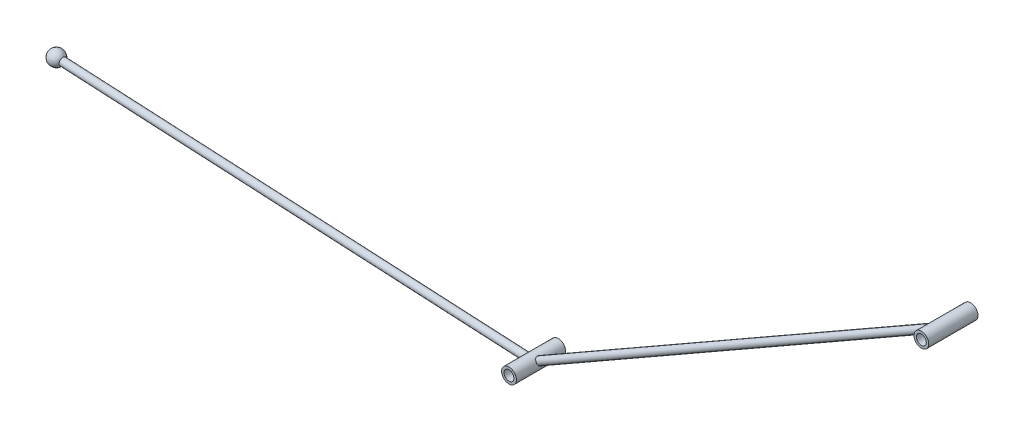
ISO-10303-21;
HEADER;
FILE_DESCRIPTION(('STEP AP214'),'2;1');
FILE_NAME('part.step','',(''),(''),'','','');
FILE_SCHEMA(('AUTOMOTIVE_DESIGN { 1 0 10303 214 1 1 1 1 }'));
ENDSEC;
DATA;
#1=APPLICATION_CONTEXT('core data for automotive mechanical design processes');
#2=APPLICATION_PROTOCOL_DEFINITION('international standard','automotive_design',2000,#1);
#3=PRODUCT_CONTEXT('',#1,'mechanical');
#4=PRODUCT('Part','Part','',(#3));
#5=PRODUCT_RELATED_PRODUCT_CATEGORY('part','',(#4));
#6=PRODUCT_DEFINITION_FORMATION('','',#4);
#7=PRODUCT_DEFINITION_CONTEXT('part definition',#1,'design');
#8=PRODUCT_DEFINITION('design','',#6,#7);
#9=PRODUCT_DEFINITION_SHAPE('','',#8);
#10=(LENGTH_UNIT() NAMED_UNIT(*) SI_UNIT(.MILLI.,.METRE.));
#11=(NAMED_UNIT(*) PLANE_ANGLE_UNIT() SI_UNIT($,.RADIAN.));
#12=(NAMED_UNIT(*) SI_UNIT($,.STERADIAN.) SOLID_ANGLE_UNIT());
#13=UNCERTAINTY_MEASURE_WITH_UNIT(LENGTH_MEASURE(1.E-05),#10,'distance_accuracy_value','');
#14=(GEOMETRIC_REPRESENTATION_CONTEXT(3) GLOBAL_UNCERTAINTY_ASSIGNED_CONTEXT((#13)) GLOBAL_UNIT_ASSIGNED_CONTEXT((#10,
#11,#12)) REPRESENTATION_CONTEXT('',''));
#15=CARTESIAN_POINT('',(0.,0.,0.));
#16=DIRECTION('',(0.,0.,1.));
#17=DIRECTION('',(1.,0.,0.));
#18=AXIS2_PLACEMENT_3D('',#15,#16,#17);
#19=CARTESIAN_POINT('',(-97.4173011447104,-164.289213700871,0.));
#20=DIRECTION('',(0.868130418271703,0.496336153097271,0.));
#21=DIRECTION('',(-0.496336153097271,0.868130418271703,0.));
#22=AXIS2_PLACEMENT_3D('',#19,#20,#21);
#23=CYLINDRICAL_SURFACE('',#22,1.49999999999999);
#24=CARTESIAN_POINT('',(-95.9063363862924,-161.697498921266,0.));
#25=CARTESIAN_POINT('',(-95.906327766988,-161.697500277417,0.0781617122928749));
#26=CARTESIAN_POINT('',(-95.9001752901491,-161.701060677745,0.156422117287567));
#27=CARTESIAN_POINT('',(-95.8761701065788,-161.715287227725,0.310540897015728));
#28=CARTESIAN_POINT('',(-95.8582928146381,-161.725968309175,0.386393872565111));
#29=CARTESIAN_POINT('',(-95.8126092529218,-161.754322079509,0.533177496515912));
#30=CARTESIAN_POINT('',(-95.7848558048388,-161.771957626346,0.604131978710382));
#31=CARTESIAN_POINT('',(-95.7214557937931,-161.814227684295,0.740136302995079));
#32=CARTESIAN_POINT('',(-95.6858088038369,-161.838862574049,0.805185825393683));
#33=CARTESIAN_POINT('',(-95.6054895195645,-161.89755989027,0.933458592836253));
#34=CARTESIAN_POINT('',(-95.5603153292763,-161.932232299069,0.996088703510311));
#35=CARTESIAN_POINT('',(-95.4655697290082,-162.010068157152,1.11211258261006));
#36=CARTESIAN_POINT('',(-95.4159961441937,-162.053235819035,1.16550174387528));
#37=CARTESIAN_POINT('',(-95.3113894604229,-162.151315511612,1.26505072672149));
#38=CARTESIAN_POINT('',(-95.2562136000047,-162.206823055507,1.31048065178929));
#39=CARTESIAN_POINT('',(-95.1464367155522,-162.327126416492,1.38771127986864));
#40=CARTESIAN_POINT('',(-95.0918353500438,-162.391916337221,1.41952058420575));
#41=CARTESIAN_POINT('',(-94.9898238576258,-162.524603082409,1.46625699195164));
#42=CARTESIAN_POINT('',(-94.9421784863655,-162.591950808789,1.4822242895333));
#43=CARTESIAN_POINT('',(-94.8519501888041,-162.731691536704,1.50024917801255));
#44=CARTESIAN_POINT('',(-94.8093642147292,-162.804081458703,1.50231518519356));
#45=CARTESIAN_POINT('',(-94.7342255500293,-162.944993284288,1.49287998904447));
#46=CARTESIAN_POINT('',(-94.7011224000718,-163.013304128806,1.48254297671816));
#47=CARTESIAN_POINT('',(-94.6410201970366,-163.149986314302,1.45067873414302));
#48=CARTESIAN_POINT('',(-94.6140216009425,-163.218357659425,1.42915066653567));
#49=CARTESIAN_POINT('',(-94.5658467125274,-163.354082504957,1.37537615086528));
#50=CARTESIAN_POINT('',(-94.5447561423573,-163.421408835452,1.3429855302419));
#51=CARTESIAN_POINT('',(-94.5084429505848,-163.552220421702,1.26860487569777));
#52=CARTESIAN_POINT('',(-94.4932224350476,-163.61570429198,1.22661140504648));
#53=CARTESIAN_POINT('',(-94.4666756153999,-163.74293445167,1.12965697270049));
#54=CARTESIAN_POINT('',(-94.4558534227741,-163.806138291308,1.073845457511));
#55=CARTESIAN_POINT('',(-94.4390208091514,-163.923978659595,0.953115412604745));
#56=CARTESIAN_POINT('',(-94.4330140792906,-163.97860859045,0.888189941588908));
#57=CARTESIAN_POINT('',(-94.424121421703,-164.080298884081,0.746027711363857));
#58=CARTESIAN_POINT('',(-94.4214579005139,-164.126658241841,0.668270965418666));
#59=CARTESIAN_POINT('',(-94.4182426738272,-164.20447703769,0.505593492961491));
#60=CARTESIAN_POINT('',(-94.4176887607249,-164.235952021334,0.420680350473656));
#61=CARTESIAN_POINT('',(-94.4172418604601,-164.279690284231,0.253178233075821));
#62=CARTESIAN_POINT('',(-94.4172999763121,-164.293278348181,0.170938321434676));
#63=CARTESIAN_POINT('',(-94.4173335657104,-164.3045144576,0.00539798772518725));
#64=CARTESIAN_POINT('',(-94.4173090976399,-164.302173762827,-0.0779016436796819));
#65=CARTESIAN_POINT('',(-94.4172964978041,-164.28292812374,-0.233480877868094));
#66=CARTESIAN_POINT('',(-94.4173046839686,-164.267644386897,-0.305969176661892));
#67=CARTESIAN_POINT('',(-94.4179013522866,-164.225667802164,-0.447551679406438));
#68=CARTESIAN_POINT('',(-94.4184900224454,-164.198971259521,-0.516644776119913));
#69=CARTESIAN_POINT('',(-94.4211298240841,-164.134125523381,-0.653116996354043));
#70=CARTESIAN_POINT('',(-94.4232474270214,-164.095503164613,-0.720268525280327));
#71=CARTESIAN_POINT('',(-94.4300979075005,-164.0090410884,-0.848203907308489));
#72=CARTESIAN_POINT('',(-94.4348321305258,-163.961196637143,-0.908984465269925));
#73=CARTESIAN_POINT('',(-94.4488446207243,-163.851380245259,-1.03046815128532));
#74=CARTESIAN_POINT('',(-94.4586204608128,-163.788387705991,-1.09019572607649));
#75=CARTESIAN_POINT('',(-94.4843310778477,-163.654939949543,-1.19911835699038));
#76=CARTESIAN_POINT('',(-94.5002679301332,-163.584482223525,-1.2483098553458));
#77=CARTESIAN_POINT('',(-94.5400061311496,-163.436458770347,-1.33586058892515));
#78=CARTESIAN_POINT('',(-94.5640039380136,-163.358754525783,-1.37389967731636));
#79=CARTESIAN_POINT('',(-94.6204550986328,-163.20079168447,-1.43570685578609));
#80=CARTESIAN_POINT('',(-94.6529009916283,-163.120535396136,-1.45948747704945));
#81=CARTESIAN_POINT('',(-94.7227026732382,-162.968033044328,-1.49005284626199));
#82=CARTESIAN_POINT('',(-94.7593348172889,-162.895727663776,-1.49819681381417));
#83=CARTESIAN_POINT('',(-94.8385127151037,-162.75415067384,-1.5012648981816));
#84=CARTESIAN_POINT('',(-94.8810563937907,-162.684878011079,-1.49619364278534));
#85=CARTESIAN_POINT('',(-94.9675326594675,-162.555930748505,-1.47387538980656));
#86=CARTESIAN_POINT('',(-95.0111889969698,-162.495924476947,-1.45745272611349));
#87=CARTESIAN_POINT('',(-95.1007042621095,-162.381689579599,-1.41400950104554));
#88=CARTESIAN_POINT('',(-95.1465635047854,-162.327461783783,-1.38698741985982));
#89=CARTESIAN_POINT('',(-95.2407521084113,-162.223354646373,-1.32190942175105));
#90=CARTESIAN_POINT('',(-95.2891032267094,-162.173760488948,-1.28343101518825));
#91=CARTESIAN_POINT('',(-95.3844258917656,-162.08199759006,-1.19706310371142));
#92=CARTESIAN_POINT('',(-95.4313967934607,-162.039832275982,-1.14916927632648));
#93=CARTESIAN_POINT('',(-95.5265462722403,-161.959124853029,-1.03980429146593));
#94=CARTESIAN_POINT('',(-95.5743798249029,-161.921360942946,-0.977456268784201));
#95=CARTESIAN_POINT('',(-95.6634270502117,-161.854664688776,-0.843823918305333));
#96=CARTESIAN_POINT('',(-95.7046348556547,-161.825740151905,-0.77253176869846));
#97=CARTESIAN_POINT('',(-95.7787068657879,-161.775835348215,-0.620045030128553));
#98=CARTESIAN_POINT('',(-95.8112662434059,-161.7551350218,-0.538608703306882));
#99=CARTESIAN_POINT('',(-95.8630250088876,-161.723053760524,-0.370001393490323));
#100=CARTESIAN_POINT('',(-95.8822690616032,-161.7116416464,-0.282850666630962));
#101=CARTESIAN_POINT('',(-95.8979209877932,-161.702420556997,-0.162291966522002));
#102=CARTESIAN_POINT('',(-95.9010687461227,-161.700576019177,-0.129948158403173));
#103=CARTESIAN_POINT('',(-95.9052783096656,-161.698114877891,-0.0650752789766343));
#104=CARTESIAN_POINT('',(-95.9063399753331,-161.697498356571,-0.0325461954211883));
#105=CARTESIAN_POINT('',(-95.9063363862924,-161.697498921266,0.));
#106=B_SPLINE_CURVE_WITH_KNOTS('',3,(#24,#25,#26,#27,#28,#29,#30,#31,#32,#33,#34,#35,#36,#37,
#38,#39,#40,#41,#42,#43,#44,#45,#46,#47,#48,#49,#50,#51,#52,#53,#54,#55,#56,#57,#58,#59,#60,#61,
#62,#63,#64,#65,#66,#67,#68,#69,#70,#71,#72,#73,#74,#75,#76,#77,#78,#79,#80,#81,#82,#83,#84,#85,
#86,#87,#88,#89,#90,#91,#92,#93,#94,#95,#96,#97,#98,#99,#100,#101,#102,#103,#104,#105),
.UNSPECIFIED.,.T.,.F.,(4,2,2,2,2,2,2,2,2,2,2,2,2,2,2,2,2,2,2,2,2,2,2,2,2,2,2,2,2,2,2,2,2,2,2,2,
2,2,2,2,4),(0.,0.234348183892071,0.469189339237205,0.702792893878332,0.936409088167719,
1.18929346874734,1.44230356626557,1.71236838358146,1.98226240445836,2.23295227451903,
2.48349035529058,2.71224146226802,2.94100968776181,3.17294302096717,3.40495949025402,
3.65890787185332,3.91305072368876,4.18333262594172,4.45333161317554,4.70193436281315,
4.95036139782557,5.17161275136036,5.39293578654092,5.62450944609129,5.85620229330069,
6.11710115370916,6.378087974673,6.64596272119446,6.91360169713152,7.15668405584228,
7.39968130190954,7.62666637307234,7.85368400268014,8.09041126079204,8.32724745151076,
8.58765362775099,8.8482891426773,9.11716123557905,9.38512699504137,9.4827020277796,
9.58028358741807),.UNSPECIFIED.);
#107=CARTESIAN_POINT('',(-95.9063363862924,-161.697498921266,0.));
#108=VERTEX_POINT('',#107);
#109=EDGE_CURVE('E47',#108,#108,#106,.T.);
#110=ORIENTED_EDGE('',*,*,#109,.T.);
#111=EDGE_LOOP('',(#110));
#112=FACE_BOUND('',#111,.T.);
#113=CARTESIAN_POINT('',(67.0475285892135,-68.531895260825,0.));
#114=CARTESIAN_POINT('',(67.0475270428304,-68.5318999125176,-0.0820213674836936));
#115=CARTESIAN_POINT('',(67.0487752375737,-68.5389637060957,-0.164077007315756));
#116=CARTESIAN_POINT('',(67.0539967196481,-68.5667945839677,-0.325774664008561));
#117=CARTESIAN_POINT('',(67.0579723148208,-68.5875732728157,-0.405414577116105));
#118=CARTESIAN_POINT('',(67.0692781499902,-68.6415780330717,-0.559857216008092));
#119=CARTESIAN_POINT('',(67.076600044665,-68.6747731021482,-0.634671449978566));
#120=CARTESIAN_POINT('',(67.0955094914474,-68.7520039441859,-0.777884854784625));
#121=CARTESIAN_POINT('',(67.1070978377218,-68.7960417349294,-0.84628282830707));
#122=CARTESIAN_POINT('',(67.1361283683587,-68.894981256492,-0.977552963403021));
#123=CARTESIAN_POINT('',(67.1537754059731,-68.9502309272265,-1.04011822706494));
#124=CARTESIAN_POINT('',(67.1959363230134,-69.0682443524952,-1.15504285623499));
#125=CARTESIAN_POINT('',(67.2204500422993,-69.1310079317759,-1.20740245970387));
#126=CARTESIAN_POINT('',(67.277168146868,-69.2614373598291,-1.30022958394907));
#127=CARTESIAN_POINT('',(67.3093539117548,-69.3290910672428,-1.34072537633111));
#128=CARTESIAN_POINT('',(67.3817901036237,-69.4666285477017,-1.4085580058442));
#129=CARTESIAN_POINT('',(67.4220352108821,-69.5365108242892,-1.43590348280701));
#130=CARTESIAN_POINT('',(67.5069314914361,-69.6704591917607,-1.47504608805));
#131=CARTESIAN_POINT('',(67.5510464971539,-69.7345774365547,-1.48783258757424));
#132=CARTESIAN_POINT('',(67.6448422048039,-69.8599343018063,-1.50117149964336));
#133=CARTESIAN_POINT('',(67.6945222516366,-69.9211732600023,-1.50172535066013));
#134=CARTESIAN_POINT('',(67.7965060679131,-70.0372581069261,-1.49120835302186));
#135=CARTESIAN_POINT('',(67.8486951264277,-70.0922362340045,-1.4804674700125));
#136=CARTESIAN_POINT('',(67.9554094244403,-70.1966402369134,-1.4486999632421));
#137=CARTESIAN_POINT('',(68.0099351644393,-70.2460649149397,-1.42767112572422));
#138=CARTESIAN_POINT('',(68.1241182148297,-70.342452166372,-1.37428468974246));
#139=CARTESIAN_POINT('',(68.1838406427205,-70.3889118288893,-1.34116340284971));
#140=CARTESIAN_POINT('',(68.3023794628343,-70.4745592432591,-1.26526544970632));
#141=CARTESIAN_POINT('',(68.3611950868038,-70.5137411096996,-1.22248103048703));
#142=CARTESIAN_POINT('',(68.4840437372519,-70.5899406856062,-1.12168229198449));
#143=CARTESIAN_POINT('',(68.5476729359881,-70.6259091537095,-1.06237987697209));
#144=CARTESIAN_POINT('',(68.6684952369234,-70.6891901264559,-0.933427763964751));
#145=CARTESIAN_POINT('',(68.7256876993048,-70.7165017710915,-0.863777038931558));
#146=CARTESIAN_POINT('',(68.8213699615377,-70.7591863651403,-0.727148888799774));
#147=CARTESIAN_POINT('',(68.8613886154218,-70.7757859773168,-0.661628957137971));
#148=CARTESIAN_POINT('',(68.9316574467504,-70.8035826521095,-0.52450324991924));
#149=CARTESIAN_POINT('',(68.9619248129801,-70.8147892385315,-0.45290846729582));
#150=CARTESIAN_POINT('',(69.0057412922243,-70.8305304806877,-0.317269556718055));
#151=CARTESIAN_POINT('',(69.0212346089342,-70.8358652055981,-0.253952262782426));
#152=CARTESIAN_POINT('',(69.0418951497477,-70.8429140344553,-0.125468203757333));
#153=CARTESIAN_POINT('',(69.0470718016151,-70.8446314441252,-0.060303182486818));
#154=CARTESIAN_POINT('',(69.046538026853,-70.8444525343043,0.0700450181415124));
#155=CARTESIAN_POINT('',(69.040816135368,-70.8425524093047,0.135228144418613));
#156=CARTESIAN_POINT('',(69.0190998783454,-70.8351296981069,0.263665294230868));
#157=CARTESIAN_POINT('',(69.0030946201859,-70.8296032706276,0.326917197616428));
#158=CARTESIAN_POINT('',(68.9577389902687,-70.8132525451585,0.463812923534978));
#159=CARTESIAN_POINT('',(68.9262050211891,-70.801520019076,0.53661842688481));
#160=CARTESIAN_POINT('',(68.8531991698628,-70.7724331776012,0.675818324099172));
#161=CARTESIAN_POINT('',(68.8117142232572,-70.755071461176,0.74220412759972));
#162=CARTESIAN_POINT('',(68.7209250033239,-70.7141269625776,0.868924897030572));
#163=CARTESIAN_POINT('',(68.6715071056248,-70.6904498422623,0.929147141628493));
#164=CARTESIAN_POINT('',(68.5676776701929,-70.6366412324829,1.04188342490163));
#165=CARTESIAN_POINT('',(68.5132652827328,-70.6065086435631,1.09439614796793));
#166=CARTESIAN_POINT('',(68.3897143868624,-70.5324255685898,1.20121241554159));
#167=CARTESIAN_POINT('',(68.3198631029706,-70.4869052482451,1.25362629673688));
#168=CARTESIAN_POINT('',(68.1787229183053,-70.3854761153421,1.34484711345679));
#169=CARTESIAN_POINT('',(68.1074338001096,-70.3295657209871,1.38365197452827));
#170=CARTESIAN_POINT('',(67.9689657268389,-70.2097480959367,1.44455797814685));
#171=CARTESIAN_POINT('',(67.9017294535058,-70.1461776625642,1.46718251345475));
#172=CARTESIAN_POINT('',(67.7719248740315,-70.0110730187366,1.4959239599263));
#173=CARTESIAN_POINT('',(67.7093500897983,-69.9395502180226,1.50206421177033));
#174=CARTESIAN_POINT('',(67.5999519053195,-69.8017762320273,1.49707907745754));
#175=CARTESIAN_POINT('',(67.5521522871489,-69.7362089716626,1.48827156512125));
#176=CARTESIAN_POINT('',(67.4632940447132,-69.6035851440645,1.45760008530838));
#177=CARTESIAN_POINT('',(67.422233714836,-69.536528958548,1.43573942790163));
#178=CARTESIAN_POINT('',(67.3498427181154,-69.4077597945776,1.38137424478499));
#179=CARTESIAN_POINT('',(67.3180621059465,-69.3459763026018,1.34962688601689));
#180=CARTESIAN_POINT('',(67.2609030525804,-69.2254787815769,1.27614680739696));
#181=CARTESIAN_POINT('',(67.2355254462716,-69.166765153598,1.2344127867647));
#182=CARTESIAN_POINT('',(67.189611422757,-69.0515473174169,1.13979171002742));
#183=CARTESIAN_POINT('',(67.1693719868771,-68.9952910731398,1.08645948655342));
#184=CARTESIAN_POINT('',(67.1345674599426,-68.8901516291532,0.971308941826207));
#185=CARTESIAN_POINT('',(67.1200057847468,-68.8412728787006,0.909485542253012));
#186=CARTESIAN_POINT('',(67.0947627304465,-68.7496724396435,0.774265882823755));
#187=CARTESIAN_POINT('',(67.084413226614,-68.7075969367626,0.700368172544665));
#188=CARTESIAN_POINT('',(67.0679502136005,-68.6359605208653,0.546343925559987));
#189=CARTESIAN_POINT('',(67.0618326024612,-68.606387500083,0.466223504550425));
#190=CARTESIAN_POINT('',(67.0539725241231,-68.5667639072047,0.321660083247379));
#191=CARTESIAN_POINT('',(67.0515331057352,-68.5537339803189,0.258058255360967));
#192=CARTESIAN_POINT('',(67.0483118677319,-68.5362984341295,0.129644640048993));
#193=CARTESIAN_POINT('',(67.0475298115375,-68.5318915839378,0.0648330266459944));
#194=CARTESIAN_POINT('',(67.0475285892135,-68.531895260825,0.));
#195=B_SPLINE_CURVE_WITH_KNOTS('',3,(#113,#114,#115,#116,#117,#118,#119,#120,#121,#122,#123,
#124,#125,#126,#127,#128,#129,#130,#131,#132,#133,#134,#135,#136,#137,#138,#139,#140,#141,#142,
#143,#144,#145,#146,#147,#148,#149,#150,#151,#152,#153,#154,#155,#156,#157,#158,#159,#160,#161,
#162,#163,#164,#165,#166,#167,#168,#169,#170,#171,#172,#173,#174,#175,#176,#177,#178,#179,#180,
#181,#182,#183,#184,#185,#186,#187,#188,#189,#190,#191,#192,#193,#194),.UNSPECIFIED.,.T.,.F.,(4,
2,2,2,2,2,2,2,2,2,2,2,2,2,2,2,2,2,2,2,2,2,2,2,2,2,2,2,2,2,2,2,2,2,2,2,2,2,2,2,4),(0.,
0.245818721450596,0.49184570404254,0.737262441199676,0.982724883887127,1.23747251694662,
1.49221420946031,1.74634381728241,2.00030623162624,2.23572794281449,2.47112196994729,
2.69982530645788,2.92857787689595,3.17540068008321,3.42242222322506,3.70361655695868,
3.98483881703913,4.21962692252935,4.4539988687949,4.64935868488043,4.8445398916643,
5.03992653510219,5.23552048316133,5.47484431251586,5.71448407988341,5.95792619060127,
6.20140979588717,6.49541938770771,6.78947377660357,7.07352352634204,7.35717086733329,
7.60072361501723,7.84421462781421,8.07236864567096,8.30055239718479,8.53988074563029,
8.77935285763368,9.03513693026913,9.29067272360243,9.4850055861861,9.67931070699574),.UNSPECIFIED.);
#196=CARTESIAN_POINT('',(67.0475285892135,-68.531895260825,0.));
#197=VERTEX_POINT('',#196);
#198=EDGE_CURVE('E36',#197,#197,#195,.T.);
#199=ORIENTED_EDGE('',*,*,#198,.T.);
#200=EDGE_LOOP('',(#199));
#201=FACE_BOUND('',#200,.T.);
#202=ADVANCED_FACE('F32',(#112,#201),#23,.T.);
#203=CARTESIAN_POINT('',(-97.4173011447104,-164.289213700871,10.));
#204=DIRECTION('',(0.,0.,-1.));
#205=DIRECTION('',(-1.,0.,0.));
#206=AXIS2_PLACEMENT_3D('',#203,#204,#205);
#207=CYLINDRICAL_SURFACE('',#206,3.00000000000001);
#208=ORIENTED_EDGE('',*,*,#109,.F.);
#209=EDGE_LOOP('',(#208));
#210=FACE_BOUND('',#209,.T.);
#211=CARTESIAN_POINT('',(-97.4173011447104,-164.289213700871,-10.));
#212=DIRECTION('',(0.,0.,1.));
#213=DIRECTION('',(1.,0.,0.));
#214=AXIS2_PLACEMENT_3D('',#211,#212,#213);
#215=CIRCLE('',#214,3.00000000000001);
#216=CARTESIAN_POINT('',(-94.4173011447104,-164.289213700871,-10.));
#217=VERTEX_POINT('',#216);
#218=EDGE_CURVE('E71',#217,#217,#215,.T.);
#219=ORIENTED_EDGE('',*,*,#218,.T.);
#220=EDGE_LOOP('',(#219));
#221=FACE_BOUND('',#220,.T.);
#222=CARTESIAN_POINT('',(-97.4173011447104,-164.289213700871,10.));
#223=DIRECTION('',(0.,0.,1.));
#224=DIRECTION('',(1.,0.,0.));
#225=AXIS2_PLACEMENT_3D('',#222,#223,#224);
#226=CIRCLE('',#225,3.00000000000001);
#227=CARTESIAN_POINT('',(-94.4173011447104,-164.289213700871,10.));
#228=VERTEX_POINT('',#227);
#229=EDGE_CURVE('E70',#228,#228,#226,.T.);
#230=ORIENTED_EDGE('',*,*,#229,.F.);
#231=EDGE_LOOP('',(#230));
#232=FACE_BOUND('',#231,.T.);
#233=CARTESIAN_POINT('',(-100.088943103179,-165.653885546316,0.));
#234=CARTESIAN_POINT('',(-100.088949623769,-165.653879748605,-0.0781617122928753));
#235=CARTESIAN_POINT('',(-100.09220352755,-165.647559817282,-0.15642211728757));
#236=CARTESIAN_POINT('',(-100.104718392427,-165.622619454018,-0.310540897015731));
#237=CARTESIAN_POINT('',(-100.113991975481,-165.603973174889,-0.386393872565113));
#238=CARTESIAN_POINT('',(-100.137117335251,-165.555433069422,-0.533177496515917));
#239=CARTESIAN_POINT('',(-100.150944727574,-165.525599034926,-0.604131978710392));
#240=CARTESIAN_POINT('',(-100.181460530792,-165.455777083123,-0.740136302995089));
#241=CARTESIAN_POINT('',(-100.198149096448,-165.415788616505,-0.805185825393689));
#242=CARTESIAN_POINT('',(-100.234027983235,-165.323002476158,-0.933458592836256));
#243=CARTESIAN_POINT('',(-100.253311118187,-165.269420351278,-0.996088703510313));
#244=CARTESIAN_POINT('',(-100.290990493439,-165.152735244027,-1.11211258261007));
#245=CARTESIAN_POINT('',(-100.30938628807,-165.089627541774,-1.16550174387528));
#246=CARTESIAN_POINT('',(-100.344427335777,-164.950579674616,-1.2650507267215));
#247=CARTESIAN_POINT('',(-100.360871003919,-164.874061253434,-1.3104806517893));
#248=CARTESIAN_POINT('',(-100.388256709501,-164.713518778823,-1.38771127986864));
#249=CARTESIAN_POINT('',(-100.399202219747,-164.629499502768,-1.41952058420575));
#250=CARTESIAN_POINT('',(-100.413363260755,-164.462731454714,-1.46625699195164));
#251=CARTESIAN_POINT('',(-100.417073397098,-164.380317666187,-1.48222428953329));
#252=CARTESIAN_POINT('',(-100.4175079067,-164.213979372579,-1.50024917801255));
#253=CARTESIAN_POINT('',(-100.414236508383,-164.13005581243,-1.50231518519356));
#254=CARTESIAN_POINT('',(-100.401340255056,-163.9708840556,-1.49287998904447));
#255=CARTESIAN_POINT('',(-100.392292640127,-163.895516087072,-1.48254297671816));
#256=CARTESIAN_POINT('',(-100.369028064304,-163.748026920848,-1.45067873414301));
#257=CARTESIAN_POINT('',(-100.354810716614,-163.675905966545,-1.42915066653566));
#258=CARTESIAN_POINT('',(-100.322026370587,-163.535666028495,-1.37537615086527));
#259=CARTESIAN_POINT('',(-100.303401914419,-163.467616219087,-1.34298553024189));
#260=CARTESIAN_POINT('',(-100.263290163545,-163.337919008493,-1.26860487569776));
#261=CARTESIAN_POINT('',(-100.241801845052,-163.276273910983,-1.22661140504648));
#262=CARTESIAN_POINT('',(-100.195406417767,-163.154866697461,-1.12965697270049));
#263=CARTESIAN_POINT('',(-100.170368146964,-163.095833400134,-1.07384545751099));
#264=CARTESIAN_POINT('',(-100.120870854487,-162.987575803093,-0.953115412604738));
#265=CARTESIAN_POINT('',(-100.096412291077,-162.938359049597,-0.888189941588906));
#266=CARTESIAN_POINT('',(-100.048958361496,-162.847981398903,-0.746027711363868));
#267=CARTESIAN_POINT('',(-100.026154549001,-162.807530557963,-0.668270965418685));
#268=CARTESIAN_POINT('',(-99.9868193457161,-162.740308207122,-0.505593492961509));
#269=CARTESIAN_POINT('',(-99.9702814143129,-162.713522422832,-0.420680350473665));
#270=CARTESIAN_POINT('',(-99.9470283125398,-162.676474769479,-0.253178233075821));
#271=CARTESIAN_POINT('',(-99.9396385874005,-162.665071663685,-0.170938321434676));
#272=CARTESIAN_POINT('',(-99.9335401222061,-162.655634502809,-0.00539798772518481));
#273=CARTESIAN_POINT('',(-99.9348252500456,-162.65759100406,0.0779016436796867));
#274=CARTESIAN_POINT('',(-99.9452331231715,-162.673779609918,0.2334808778681));
#275=CARTESIAN_POINT('',(-99.9534831253158,-162.686645461755,0.305969176661896));
#276=CARTESIAN_POINT('',(-99.9756584660819,-162.722291554681,0.447551679406442));
#277=CARTESIAN_POINT('',(-99.9895856425495,-162.745075006511,0.516644776119919));
#278=CARTESIAN_POINT('',(-100.022396502282,-162.801069519919,0.653116996354047));
#279=CARTESIAN_POINT('',(-100.041479872057,-162.834714665736,0.720268525280327));
#280=CARTESIAN_POINT('',(-100.082425418635,-162.911174340869,0.84820390730849));
#281=CARTESIAN_POINT('',(-100.104289020595,-162.953993580621,0.908984465269929));
#282=CARTESIAN_POINT('',(-100.151824601756,-163.053975370622,1.03046815128533));
#283=CARTESIAN_POINT('',(-100.177629236521,-163.112265574581,1.0901957260765));
#284=CARTESIAN_POINT('',(-100.228087333786,-163.238453212444,1.19911835699039));
#285=CARTESIAN_POINT('',(-100.252740405242,-163.306353878746,1.24830985534581));
#286=CARTESIAN_POINT('',(-100.299268518414,-163.452385389028,1.33586058892515));
#287=CARTESIAN_POINT('',(-100.321053071181,-163.530738931503,1.37389967731637));
#288=CARTESIAN_POINT('',(-100.358886706881,-163.694163558719,1.43570685578609));
#289=CARTESIAN_POINT('',(-100.374940821025,-163.7792286703,1.45948747704945));
#290=CARTESIAN_POINT('',(-100.398589872767,-163.945270726462,1.49005284626199));
#291=CARTESIAN_POINT('',(-100.406825810544,-164.025906645031,1.49819681381417));
#292=CARTESIAN_POINT('',(-100.416682354257,-164.187820301428,1.5012648981816));
#293=CARTESIAN_POINT('',(-100.418305275469,-164.269097804644,1.49619364278534));
#294=CARTESIAN_POINT('',(-100.415197075976,-164.424326281884,1.47387538980656));
#295=CARTESIAN_POINT('',(-100.410877604645,-164.498407120148,1.45745272611348));
#296=CARTESIAN_POINT('',(-100.397263841435,-164.642896773467,1.41400950104553));
#297=CARTESIAN_POINT('',(-100.387968836062,-164.713305060288,1.38698741985981));
#298=CARTESIAN_POINT('',(-100.364950983852,-164.851796820304,1.32190942175104));
#299=CARTESIAN_POINT('',(-100.351055759986,-164.919652062143,1.28343101518824));
#300=CARTESIAN_POINT('',(-100.320414727481,-165.048368678059,1.19706310371142));
#301=CARTESIAN_POINT('',(-100.303667610057,-165.109226819464,1.14916927632649));
#302=CARTESIAN_POINT('',(-100.267199701809,-165.228546570972,1.03980429146594));
#303=CARTESIAN_POINT('',(-100.24734883839,-165.286166922295,0.977456268784206));
#304=CARTESIAN_POINT('',(-100.208446643918,-165.390399440833,0.84382391830534));
#305=CARTESIAN_POINT('',(-100.189396032406,-165.437001868491,0.77253176869847));
#306=CARTESIAN_POINT('',(-100.154024224378,-165.51901398536,0.620045030128561));
#307=CARTESIAN_POINT('',(-100.137808308035,-165.554023421827,0.538608703306887));
#308=CARTESIAN_POINT('',(-100.111584339695,-165.60898232114,0.370001393490321));
#309=CARTESIAN_POINT('',(-100.101555546039,-165.628982151428,0.282850666630958));
#310=CARTESIAN_POINT('',(-100.093365885686,-165.645197599202,0.162291966521992));
#311=CARTESIAN_POINT('',(-100.091713506815,-165.648450343634,0.129948158403163));
#312=CARTESIAN_POINT('',(-100.089500721464,-165.652795596519,0.0650752789766287));
#313=CARTESIAN_POINT('',(-100.088940388033,-165.653887960458,0.0325461954211856));
#314=CARTESIAN_POINT('',(-100.088943103179,-165.653885546316,0.));
#315=B_SPLINE_CURVE_WITH_KNOTS('',3,(#233,#234,#235,#236,#237,#238,#239,#240,#241,#242,#243,
#244,#245,#246,#247,#248,#249,#250,#251,#252,#253,#254,#255,#256,#257,#258,#259,#260,#261,#262,
#263,#264,#265,#266,#267,#268,#269,#270,#271,#272,#273,#274,#275,#276,#277,#278,#279,#280,#281,
#282,#283,#284,#285,#286,#287,#288,#289,#290,#291,#292,#293,#294,#295,#296,#297,#298,#299,#300,
#301,#302,#303,#304,#305,#306,#307,#308,#309,#310,#311,#312,#313,#314),.UNSPECIFIED.,.T.,.F.,(4,
2,2,2,2,2,2,2,2,2,2,2,2,2,2,2,2,2,2,2,2,2,2,2,2,2,2,2,2,2,2,2,2,2,2,2,2,2,2,2,4),(0.,
0.234348183892076,0.469189339237208,0.702792893878343,0.93640908816773,1.18929346874735,
1.44230356626557,1.71236838358146,1.98226240445837,2.232952274519,2.48349035529059,
2.71224146226808,2.94100968776184,3.17294302096722,3.40495949025405,3.65890787185332,
3.91305072368877,4.18333262594171,4.45333161317555,4.70193436281316,4.95036139782559,
5.17161275136038,5.39293578654094,5.6245094460913,5.85620229330071,6.11710115370921,
6.37808797467303,6.64596272119447,6.91360169713156,7.15668405584232,7.39968130190956,
7.62666637307239,7.85368400268018,8.09041126079204,8.32724745151076,8.58765362775098,
8.84828914267728,9.11716123557905,9.38512699504139,9.48270202777961,9.58028358741808),.UNSPECIFIED.);
#316=CARTESIAN_POINT('',(-100.088943103179,-165.653885546316,0.));
#317=VERTEX_POINT('',#316);
#318=EDGE_CURVE('E11',#317,#317,#315,.T.);
#319=ORIENTED_EDGE('',*,*,#318,.T.);
#320=EDGE_LOOP('',(#319));
#321=FACE_BOUND('',#320,.T.);
#322=ADVANCED_FACE('F56',(#210,#221,#232,#321),#207,.T.);
#323=CARTESIAN_POINT('',(-97.4173011447104,-164.289213700871,10.));
#324=DIRECTION('',(0.,0.,1.));
#325=DIRECTION('',(1.,0.,0.));
#326=AXIS2_PLACEMENT_3D('',#323,#324,#325);
#327=PLANE('',#326);
#328=CARTESIAN_POINT('',(-97.4173011447104,-164.289213700871,10.));
#329=DIRECTION('',(0.,0.,1.));
#330=DIRECTION('',(1.,0.,0.));
#331=AXIS2_PLACEMENT_3D('',#328,#329,#330);
#332=CIRCLE('',#331,2.);
#333=CARTESIAN_POINT('',(-95.4173011447104,-164.289213700871,10.));
#334=VERTEX_POINT('',#333);
#335=EDGE_CURVE('E83',#334,#334,#332,.T.);
#336=ORIENTED_EDGE('',*,*,#335,.F.);
#337=EDGE_LOOP('',(#336));
#338=FACE_BOUND('',#337,.T.);
#339=ORIENTED_EDGE('',*,*,#229,.T.);
#340=EDGE_LOOP('',(#339));
#341=FACE_BOUND('',#340,.T.);
#342=ADVANCED_FACE('F60',(#338,#341),#327,.T.);
#343=CARTESIAN_POINT('',(-97.4173011447104,-164.289213700871,-10.));
#344=DIRECTION('',(0.,0.,1.));
#345=DIRECTION('',(1.,0.,0.));
#346=AXIS2_PLACEMENT_3D('',#343,#344,#345);
#347=PLANE('',#346);
#348=CARTESIAN_POINT('',(-97.4173011447104,-164.289213700871,-10.));
#349=DIRECTION('',(0.,0.,1.));
#350=DIRECTION('',(1.,0.,0.));
#351=AXIS2_PLACEMENT_3D('',#348,#349,#350);
#352=CIRCLE('',#351,2.);
#353=CARTESIAN_POINT('',(-95.4173011447104,-164.289213700871,-10.));
#354=VERTEX_POINT('',#353);
#355=EDGE_CURVE('E80',#354,#354,#352,.T.);
#356=ORIENTED_EDGE('',*,*,#355,.T.);
#357=EDGE_LOOP('',(#356));
#358=FACE_BOUND('',#357,.T.);
#359=ORIENTED_EDGE('',*,*,#218,.F.);
#360=EDGE_LOOP('',(#359));
#361=FACE_BOUND('',#360,.T.);
#362=ADVANCED_FACE('F62',(#358,#361),#347,.F.);
#363=CARTESIAN_POINT('',(-291.161591592414,-154.331808470789,0.));
#364=DIRECTION('',(0.998681909524243,-0.0513268310829016,0.));
#365=DIRECTION('',(-0.0513268310829016,-0.998681909524243,0.));
#366=AXIS2_PLACEMENT_3D('',#363,#364,#365);
#367=SPHERICAL_SURFACE('',#366,2.99999999999998);
#368=CARTESIAN_POINT('',(-288.56693988057,-154.465159489629,0.));
#369=DIRECTION('',(-0.99868190952424,0.0513268310828985,0.));
#370=DIRECTION('',(-0.0513268310828986,-0.998681909524243,0.));
#371=AXIS2_PLACEMENT_3D('',#368,#369,#370);
#372=CIRCLE('',#371,1.49999999999999);
#373=CARTESIAN_POINT('',(-288.643930127194,-155.963182353916,0.));
#374=VERTEX_POINT('',#373);
#375=EDGE_CURVE('E43',#374,#374,#372,.F.);
#376=ORIENTED_EDGE('',*,*,#375,.F.);
#377=EDGE_LOOP('',(#376));
#378=FACE_BOUND('',#377,.T.);
#379=ADVANCED_FACE('F64',(#378),#367,.T.);
#380=CARTESIAN_POINT('',(-93.1802526418729,-164.506975002764,0.));
#381=DIRECTION('',(-0.998681909524243,0.0513268310828972,0.));
#382=DIRECTION('',(-0.0513268310828972,-0.998681909524243,0.));
#383=AXIS2_PLACEMENT_3D('',#380,#381,#382);
#384=CYLINDRICAL_SURFACE('',#383,1.49999999999999);
#385=ORIENTED_EDGE('',*,*,#375,.T.);
#386=EDGE_LOOP('',(#385));
#387=FACE_BOUND('',#386,.T.);
#388=ORIENTED_EDGE('',*,*,#318,.F.);
#389=EDGE_LOOP('',(#388));
#390=FACE_BOUND('',#389,.T.);
#391=ADVANCED_FACE('F53',(#387,#390),#384,.T.);
#392=CARTESIAN_POINT('',(70.,-68.,10.));
#393=DIRECTION('',(0.,0.,-1.));
#394=DIRECTION('',(-1.,0.,0.));
#395=AXIS2_PLACEMENT_3D('',#392,#393,#394);
#396=CYLINDRICAL_SURFACE('',#395,3.00000000000001);
#397=ORIENTED_EDGE('',*,*,#198,.F.);
#398=EDGE_LOOP('',(#397));
#399=FACE_BOUND('',#398,.T.);
#400=CARTESIAN_POINT('',(70.,-68.,10.));
#401=DIRECTION('',(0.,0.,1.));
#402=DIRECTION('',(1.,0.,0.));
#403=AXIS2_PLACEMENT_3D('',#400,#401,#402);
#404=CIRCLE('',#403,3.00000000000001);
#405=CARTESIAN_POINT('',(73.,-68.,10.));
#406=VERTEX_POINT('',#405);
#407=EDGE_CURVE('E79',#406,#406,#404,.T.);
#408=ORIENTED_EDGE('',*,*,#407,.F.);
#409=EDGE_LOOP('',(#408));
#410=FACE_BOUND('',#409,.T.);
#411=CARTESIAN_POINT('',(70.,-68.,-10.));
#412=DIRECTION('',(0.,0.,1.));
#413=DIRECTION('',(1.,0.,0.));
#414=AXIS2_PLACEMENT_3D('',#411,#412,#413);
#415=CIRCLE('',#414,3.00000000000001);
#416=CARTESIAN_POINT('',(73.,-68.,-10.));
#417=VERTEX_POINT('',#416);
#418=EDGE_CURVE('E76',#417,#417,#415,.T.);
#419=ORIENTED_EDGE('',*,*,#418,.T.);
#420=EDGE_LOOP('',(#419));
#421=FACE_BOUND('',#420,.T.);
#422=ADVANCED_FACE('F108',(#399,#410,#421),#396,.T.);
#423=CARTESIAN_POINT('',(70.,-68.,10.));
#424=DIRECTION('',(0.,0.,1.));
#425=DIRECTION('',(1.,0.,0.));
#426=AXIS2_PLACEMENT_3D('',#423,#424,#425);
#427=PLANE('',#426);
#428=CARTESIAN_POINT('',(70.,-68.,10.));
#429=DIRECTION('',(0.,0.,1.));
#430=DIRECTION('',(1.,0.,0.));
#431=AXIS2_PLACEMENT_3D('',#428,#429,#430);
#432=CIRCLE('',#431,2.);
#433=CARTESIAN_POINT('',(72.,-68.,10.));
#434=VERTEX_POINT('',#433);
#435=EDGE_CURVE('E89',#434,#434,#432,.T.);
#436=ORIENTED_EDGE('',*,*,#435,.F.);
#437=EDGE_LOOP('',(#436));
#438=FACE_BOUND('',#437,.T.);
#439=ORIENTED_EDGE('',*,*,#407,.T.);
#440=EDGE_LOOP('',(#439));
#441=FACE_BOUND('',#440,.T.);
#442=ADVANCED_FACE('F105',(#438,#441),#427,.T.);
#443=CARTESIAN_POINT('',(70.,-68.,-10.));
#444=DIRECTION('',(0.,0.,1.));
#445=DIRECTION('',(1.,0.,0.));
#446=AXIS2_PLACEMENT_3D('',#443,#444,#445);
#447=PLANE('',#446);
#448=CARTESIAN_POINT('',(70.,-68.,-10.));
#449=DIRECTION('',(0.,0.,1.));
#450=DIRECTION('',(1.,0.,0.));
#451=AXIS2_PLACEMENT_3D('',#448,#449,#450);
#452=CIRCLE('',#451,2.);
#453=CARTESIAN_POINT('',(72.,-68.,-10.));
#454=VERTEX_POINT('',#453);
#455=EDGE_CURVE('E86',#454,#454,#452,.T.);
#456=ORIENTED_EDGE('',*,*,#455,.T.);
#457=EDGE_LOOP('',(#456));
#458=FACE_BOUND('',#457,.T.);
#459=ORIENTED_EDGE('',*,*,#418,.F.);
#460=EDGE_LOOP('',(#459));
#461=FACE_BOUND('',#460,.T.);
#462=ADVANCED_FACE('F95',(#458,#461),#447,.F.);
#463=CARTESIAN_POINT('',(-97.4173011447104,-164.289213700871,-10.));
#464=DIRECTION('',(0.,0.,1.));
#465=DIRECTION('',(1.,0.,0.));
#466=AXIS2_PLACEMENT_3D('',#463,#464,#465);
#467=CYLINDRICAL_SURFACE('',#466,2.);
#468=ORIENTED_EDGE('',*,*,#355,.F.);
#469=EDGE_LOOP('',(#468));
#470=FACE_BOUND('',#469,.T.);
#471=ORIENTED_EDGE('',*,*,#335,.T.);
#472=EDGE_LOOP('',(#471));
#473=FACE_BOUND('',#472,.T.);
#474=ADVANCED_FACE('F101',(#470,#473),#467,.F.);
#475=CARTESIAN_POINT('',(70.,-68.,-10.));
#476=DIRECTION('',(0.,0.,1.));
#477=DIRECTION('',(1.,0.,0.));
#478=AXIS2_PLACEMENT_3D('',#475,#476,#477);
#479=CYLINDRICAL_SURFACE('',#478,2.);
#480=ORIENTED_EDGE('',*,*,#455,.F.);
#481=EDGE_LOOP('',(#480));
#482=FACE_BOUND('',#481,.T.);
#483=ORIENTED_EDGE('',*,*,#435,.T.);
#484=EDGE_LOOP('',(#483));
#485=FACE_BOUND('',#484,.T.);
#486=ADVANCED_FACE('F98',(#482,#485),#479,.F.);
#487=CLOSED_SHELL('',(#202,#322,#342,#362,#379,#391,#422,#442,#462,#474,#486));
#488=MANIFOLD_SOLID_BREP('B2',#487);
#489=ADVANCED_BREP_SHAPE_REPRESENTATION('',(#18,#488),#14);
#490=SHAPE_DEFINITION_REPRESENTATION(#9,#489);
ENDSEC;
END-ISO-10303-21;
